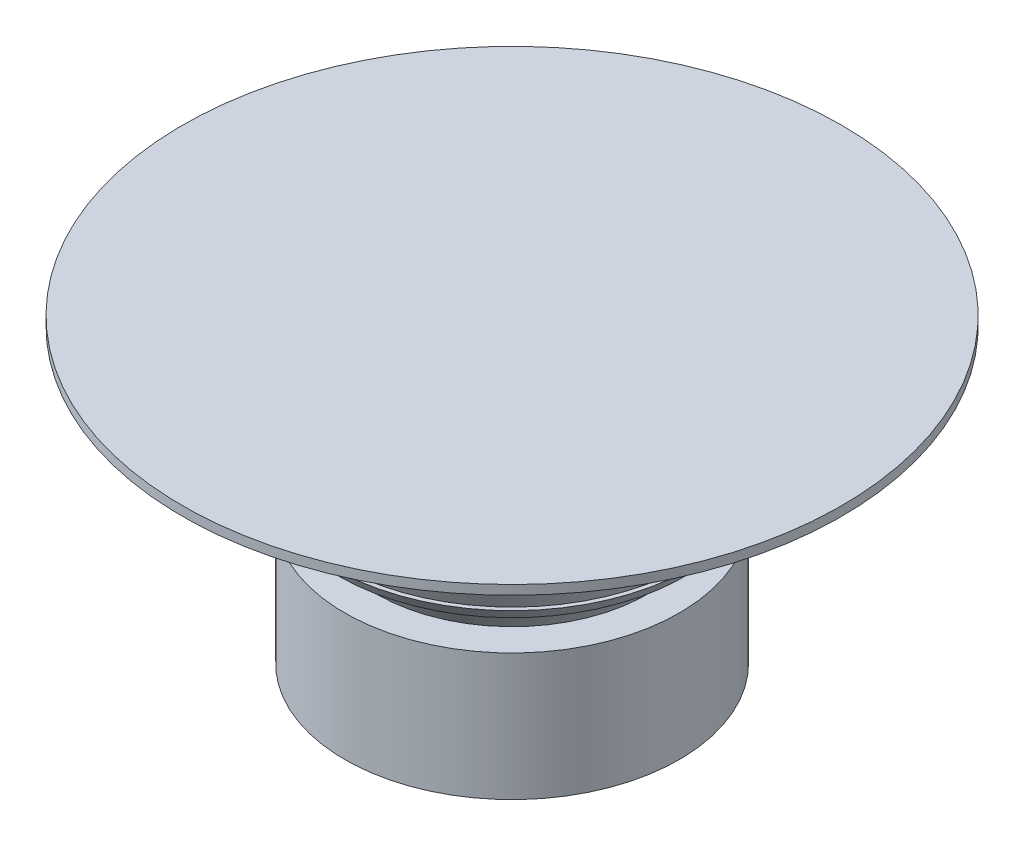
ISO-10303-21;
HEADER;
FILE_DESCRIPTION(('STEP AP214'),'2;1');
FILE_NAME('part.step','',(''),(''),'','','');
FILE_SCHEMA(('AUTOMOTIVE_DESIGN { 1 0 10303 214 1 1 1 1 }'));
ENDSEC;
DATA;
#1=APPLICATION_CONTEXT('core data for automotive mechanical design processes');
#2=APPLICATION_PROTOCOL_DEFINITION('international standard','automotive_design',2000,#1);
#3=PRODUCT_CONTEXT('',#1,'mechanical');
#4=PRODUCT('Part','Part','',(#3));
#5=PRODUCT_RELATED_PRODUCT_CATEGORY('part','',(#4));
#6=PRODUCT_DEFINITION_FORMATION('','',#4);
#7=PRODUCT_DEFINITION_CONTEXT('part definition',#1,'design');
#8=PRODUCT_DEFINITION('design','',#6,#7);
#9=PRODUCT_DEFINITION_SHAPE('','',#8);
#10=(LENGTH_UNIT() NAMED_UNIT(*) SI_UNIT(.MILLI.,.METRE.));
#11=(NAMED_UNIT(*) PLANE_ANGLE_UNIT() SI_UNIT($,.RADIAN.));
#12=(NAMED_UNIT(*) SI_UNIT($,.STERADIAN.) SOLID_ANGLE_UNIT());
#13=UNCERTAINTY_MEASURE_WITH_UNIT(LENGTH_MEASURE(1.E-05),#10,'distance_accuracy_value','');
#14=(GEOMETRIC_REPRESENTATION_CONTEXT(3) GLOBAL_UNCERTAINTY_ASSIGNED_CONTEXT((#13)) GLOBAL_UNIT_ASSIGNED_CONTEXT((#10,
#11,#12)) REPRESENTATION_CONTEXT('',''));
#15=CARTESIAN_POINT('',(0.,0.,0.));
#16=DIRECTION('',(0.,0.,1.));
#17=DIRECTION('',(1.,0.,0.));
#18=AXIS2_PLACEMENT_3D('',#15,#16,#17);
#19=CARTESIAN_POINT('',(0.,52.0358333333333,0.));
#20=DIRECTION('',(0.,1.,0.));
#21=DIRECTION('',(0.,0.,1.));
#22=AXIS2_PLACEMENT_3D('',#19,#20,#21);
#23=CONICAL_SURFACE('',#22,55.3356666666667,0.523278322131974);
#24=CARTESIAN_POINT('',(0.,66.2504999999999,0.));
#25=DIRECTION('',(0.,-1.,0.));
#26=DIRECTION('',(0.,0.,-1.));
#27=AXIS2_PLACEMENT_3D('',#24,#25,#26);
#28=CIRCLE('',#27,63.5364358974358);
#29=CARTESIAN_POINT('',(0.,66.2504999999999,-63.5364358974358));
#30=VERTEX_POINT('',#29);
#31=EDGE_CURVE('E43',#30,#30,#28,.F.);
#32=ORIENTED_EDGE('',*,*,#31,.F.);
#33=EDGE_LOOP('',(#32));
#34=FACE_BOUND('',#33,.T.);
#35=CARTESIAN_POINT('',(0.,52.0358333333333,0.));
#36=DIRECTION('',(0.,-1.,0.));
#37=DIRECTION('',(0.,0.,-1.));
#38=AXIS2_PLACEMENT_3D('',#35,#36,#37);
#39=CIRCLE('',#38,55.3356666666667);
#40=CARTESIAN_POINT('',(0.,52.0358333333333,-55.3356666666667));
#41=VERTEX_POINT('',#40);
#42=EDGE_CURVE('E10',#41,#41,#39,.T.);
#43=ORIENTED_EDGE('',*,*,#42,.F.);
#44=EDGE_LOOP('',(#43));
#45=FACE_BOUND('',#44,.T.);
#46=ADVANCED_FACE('F29',(#34,#45),#23,.T.);
#47=CARTESIAN_POINT('',(68.535,52.0358333333333,0.));
#48=DIRECTION('',(0.,1.,0.));
#49=DIRECTION('',(0.,0.,1.));
#50=AXIS2_PLACEMENT_3D('',#47,#48,#49);
#51=PLANE('',#50);
#52=ORIENTED_EDGE('',*,*,#42,.T.);
#53=EDGE_LOOP('',(#52));
#54=FACE_BOUND('',#53,.T.);
#55=CARTESIAN_POINT('',(0.,52.0358333333333,0.));
#56=DIRECTION('',(0.,-1.,0.));
#57=DIRECTION('',(0.,0.,-1.));
#58=AXIS2_PLACEMENT_3D('',#55,#56,#57);
#59=CIRCLE('',#58,68.535);
#60=CARTESIAN_POINT('',(0.,52.0358333333333,-68.535));
#61=VERTEX_POINT('',#60);
#62=EDGE_CURVE('E35',#61,#61,#59,.T.);
#63=ORIENTED_EDGE('',*,*,#62,.F.);
#64=EDGE_LOOP('',(#63));
#65=FACE_BOUND('',#64,.T.);
#66=ADVANCED_FACE('F88',(#54,#65),#51,.T.);
#67=CARTESIAN_POINT('',(0.,0.,0.));
#68=DIRECTION('',(0.,-1.,0.));
#69=DIRECTION('',(0.,0.,-1.));
#70=AXIS2_PLACEMENT_3D('',#67,#68,#69);
#71=CYLINDRICAL_SURFACE('',#70,68.535);
#72=ORIENTED_EDGE('',*,*,#62,.T.);
#73=EDGE_LOOP('',(#72));
#74=FACE_BOUND('',#73,.T.);
#75=CARTESIAN_POINT('',(0.,0.,0.));
#76=DIRECTION('',(0.,-1.,0.));
#77=DIRECTION('',(0.,0.,-1.));
#78=AXIS2_PLACEMENT_3D('',#75,#76,#77);
#79=CIRCLE('',#78,68.535);
#80=CARTESIAN_POINT('',(0.,0.,-68.535));
#81=VERTEX_POINT('',#80);
#82=EDGE_CURVE('E39',#81,#81,#79,.T.);
#83=ORIENTED_EDGE('',*,*,#82,.F.);
#84=EDGE_LOOP('',(#83));
#85=FACE_BOUND('',#84,.T.);
#86=ADVANCED_FACE('F93',(#74,#85),#71,.T.);
#87=CARTESIAN_POINT('',(24.8756666666666,0.,0.));
#88=DIRECTION('',(0.,-1.,0.));
#89=DIRECTION('',(0.,0.,-1.));
#90=AXIS2_PLACEMENT_3D('',#87,#88,#89);
#91=PLANE('',#90);
#92=ORIENTED_EDGE('',*,*,#82,.T.);
#93=EDGE_LOOP('',(#92));
#94=FACE_BOUND('',#93,.T.);
#95=ADVANCED_FACE('F127',(#94),#91,.T.);
#96=CARTESIAN_POINT('',(73.8655,70.8194999999999,0.));
#97=DIRECTION('',(0.,1.,0.));
#98=DIRECTION('',(0.,0.,1.));
#99=AXIS2_PLACEMENT_3D('',#96,#97,#98);
#100=PLANE('',#99);
#101=CARTESIAN_POINT('',(0.,70.8194999999999,0.));
#102=DIRECTION('',(0.,-1.,0.));
#103=DIRECTION('',(0.,0.,-1.));
#104=AXIS2_PLACEMENT_3D('',#101,#102,#103);
#105=CIRCLE('',#104,72.0886666666667);
#106=CARTESIAN_POINT('',(0.,70.8194999999999,-72.0886666666667));
#107=VERTEX_POINT('',#106);
#108=EDGE_CURVE('E48',#107,#107,#105,.T.);
#109=ORIENTED_EDGE('',*,*,#108,.T.);
#110=EDGE_LOOP('',(#109));
#111=FACE_BOUND('',#110,.T.);
#112=CARTESIAN_POINT('',(0.,70.8194999999999,0.));
#113=DIRECTION('',(0.,-1.,0.));
#114=DIRECTION('',(0.,0.,-1.));
#115=AXIS2_PLACEMENT_3D('',#112,#113,#114);
#116=CIRCLE('',#115,73.8655);
#117=CARTESIAN_POINT('',(0.,70.8194999999999,-73.8655));
#118=VERTEX_POINT('',#117);
#119=EDGE_CURVE('E57',#118,#118,#116,.T.);
#120=ORIENTED_EDGE('',*,*,#119,.F.);
#121=EDGE_LOOP('',(#120));
#122=FACE_BOUND('',#121,.T.);
#123=ADVANCED_FACE('F123',(#111,#122),#100,.T.);
#124=CARTESIAN_POINT('',(0.,70.8194999999999,0.));
#125=DIRECTION('',(0.,1.,0.));
#126=DIRECTION('',(0.,0.,1.));
#127=AXIS2_PLACEMENT_3D('',#124,#125,#126);
#128=CONICAL_SURFACE('',#127,72.0886666666667,0.355635884300756);
#129=CARTESIAN_POINT('',(0.,94.6206018356625,0.));
#130=DIRECTION('',(0.,-1.,0.));
#131=DIRECTION('',(0.,0.,-1.));
#132=AXIS2_PLACEMENT_3D('',#129,#130,#131);
#133=CIRCLE('',#132,80.9290759199127);
#134=CARTESIAN_POINT('',(0.,94.6206018356625,-80.9290759199127));
#135=VERTEX_POINT('',#134);
#136=EDGE_CURVE('E51',#135,#135,#133,.T.);
#137=ORIENTED_EDGE('',*,*,#136,.T.);
#138=EDGE_LOOP('',(#137));
#139=FACE_BOUND('',#138,.T.);
#140=ORIENTED_EDGE('',*,*,#108,.F.);
#141=EDGE_LOOP('',(#140));
#142=FACE_BOUND('',#141,.T.);
#143=ADVANCED_FACE('F119',(#139,#142),#128,.T.);
#144=CARTESIAN_POINT('',(0.,42.2074752829374,0.));
#145=DIRECTION('',(0.,-1.,0.));
#146=DIRECTION('',(0.,0.,-1.));
#147=AXIS2_PLACEMENT_3D('',#144,#145,#146);
#148=TOROIDAL_SURFACE('',#147,208.635067954986,138.043312901039);
#149=CARTESIAN_POINT('',(0.,109.909833333333,0.));
#150=DIRECTION('',(0.,1.,0.));
#151=DIRECTION('',(0.,0.,1.));
#152=AXIS2_PLACEMENT_3D('',#149,#150,#151);
#153=CIRCLE('',#152,88.3339999999999);
#154=CARTESIAN_POINT('',(0.,109.909833333333,88.3339999999999));
#155=VERTEX_POINT('',#154);
#156=EDGE_CURVE('E60',#155,#155,#153,.T.);
#157=ORIENTED_EDGE('',*,*,#156,.F.);
#158=EDGE_LOOP('',(#157));
#159=FACE_BOUND('',#158,.T.);
#160=ORIENTED_EDGE('',*,*,#136,.F.);
#161=EDGE_LOOP('',(#160));
#162=FACE_BOUND('',#161,.T.);
#163=ADVANCED_FACE('F101',(#159,#162),#148,.F.);
#164=CARTESIAN_POINT('',(0.,66.2504999999999,0.));
#165=DIRECTION('',(0.,-1.,0.));
#166=DIRECTION('',(0.,0.,-1.));
#167=AXIS2_PLACEMENT_3D('',#164,#165,#166);
#168=PLANE('',#167);
#169=ORIENTED_EDGE('',*,*,#31,.T.);
#170=EDGE_LOOP('',(#169));
#171=FACE_BOUND('',#170,.T.);
#172=CARTESIAN_POINT('',(0.,66.2504999999999,0.));
#173=DIRECTION('',(0.,-1.,0.));
#174=DIRECTION('',(0.,0.,-1.));
#175=AXIS2_PLACEMENT_3D('',#172,#173,#174);
#176=CIRCLE('',#175,70.9282857142856);
#177=CARTESIAN_POINT('',(0.,66.2504999999999,-70.9282857142856));
#178=VERTEX_POINT('',#177);
#179=EDGE_CURVE('E54',#178,#178,#176,.T.);
#180=ORIENTED_EDGE('',*,*,#179,.T.);
#181=EDGE_LOOP('',(#180));
#182=FACE_BOUND('',#181,.T.);
#183=ADVANCED_FACE('F97',(#171,#182),#168,.T.);
#184=CARTESIAN_POINT('',(0.,66.2504999999999,0.));
#185=DIRECTION('',(0.,1.,0.));
#186=DIRECTION('',(0.,0.,1.));
#187=AXIS2_PLACEMENT_3D('',#184,#185,#186);
#188=CONICAL_SURFACE('',#187,70.9282857142856,0.571337479833634);
#189=ORIENTED_EDGE('',*,*,#119,.T.);
#190=EDGE_LOOP('',(#189));
#191=FACE_BOUND('',#190,.T.);
#192=ORIENTED_EDGE('',*,*,#179,.F.);
#193=EDGE_LOOP('',(#192));
#194=FACE_BOUND('',#193,.T.);
#195=ADVANCED_FACE('F100',(#191,#194),#188,.T.);
#196=CARTESIAN_POINT('',(0.,109.909833333333,0.));
#197=DIRECTION('',(0.,-1.,0.));
#198=DIRECTION('',(0.,0.,-1.));
#199=AXIS2_PLACEMENT_3D('',#196,#197,#198);
#200=PLANE('',#199);
#201=ORIENTED_EDGE('',*,*,#156,.T.);
#202=EDGE_LOOP('',(#201));
#203=FACE_BOUND('',#202,.T.);
#204=CARTESIAN_POINT('',(0.,109.909833333333,0.));
#205=DIRECTION('',(0.,-1.,0.));
#206=DIRECTION('',(0.,0.,-1.));
#207=AXIS2_PLACEMENT_3D('',#204,#205,#206);
#208=CIRCLE('',#207,113.4635);
#209=CARTESIAN_POINT('',(0.,109.909833333333,-113.4635));
#210=VERTEX_POINT('',#209);
#211=EDGE_CURVE('E63',#210,#210,#208,.T.);
#212=ORIENTED_EDGE('',*,*,#211,.T.);
#213=EDGE_LOOP('',(#212));
#214=FACE_BOUND('',#213,.T.);
#215=ADVANCED_FACE('F106',(#203,#214),#200,.T.);
#216=CARTESIAN_POINT('',(0.,0.,0.));
#217=DIRECTION('',(0.,-1.,0.));
#218=DIRECTION('',(0.,0.,-1.));
#219=AXIS2_PLACEMENT_3D('',#216,#217,#218);
#220=CYLINDRICAL_SURFACE('',#219,113.4635);
#221=CARTESIAN_POINT('',(0.,119.5555,0.));
#222=DIRECTION('',(0.,-1.,0.));
#223=DIRECTION('',(0.,0.,-1.));
#224=AXIS2_PLACEMENT_3D('',#221,#222,#223);
#225=CIRCLE('',#224,113.4635);
#226=CARTESIAN_POINT('',(0.,119.5555,-113.4635));
#227=VERTEX_POINT('',#226);
#228=EDGE_CURVE('E66',#227,#227,#225,.T.);
#229=ORIENTED_EDGE('',*,*,#228,.T.);
#230=EDGE_LOOP('',(#229));
#231=FACE_BOUND('',#230,.T.);
#232=ORIENTED_EDGE('',*,*,#211,.F.);
#233=EDGE_LOOP('',(#232));
#234=FACE_BOUND('',#233,.T.);
#235=ADVANCED_FACE('F112',(#231,#234),#220,.T.);
#236=CARTESIAN_POINT('',(135.039333333333,119.5555,0.));
#237=DIRECTION('',(0.,-1.,0.));
#238=DIRECTION('',(0.,0.,-1.));
#239=AXIS2_PLACEMENT_3D('',#236,#237,#238);
#240=PLANE('',#239);
#241=CARTESIAN_POINT('',(0.,119.5555,0.));
#242=DIRECTION('',(0.,-1.,0.));
#243=DIRECTION('',(0.,0.,-1.));
#244=AXIS2_PLACEMENT_3D('',#241,#242,#243);
#245=CIRCLE('',#244,135.039333333333);
#246=CARTESIAN_POINT('',(0.,119.5555,-135.039333333333));
#247=VERTEX_POINT('',#246);
#248=EDGE_CURVE('E69',#247,#247,#245,.T.);
#249=ORIENTED_EDGE('',*,*,#248,.T.);
#250=EDGE_LOOP('',(#249));
#251=FACE_BOUND('',#250,.T.);
#252=ORIENTED_EDGE('',*,*,#228,.F.);
#253=EDGE_LOOP('',(#252));
#254=FACE_BOUND('',#253,.T.);
#255=ADVANCED_FACE('F85',(#251,#254),#240,.T.);
#256=CARTESIAN_POINT('',(0.,0.,0.));
#257=DIRECTION('',(0.,-1.,0.));
#258=DIRECTION('',(0.,0.,-1.));
#259=AXIS2_PLACEMENT_3D('',#256,#257,#258);
#260=CYLINDRICAL_SURFACE('',#259,135.039333333333);
#261=CARTESIAN_POINT('',(0.,123.363,0.));
#262=DIRECTION('',(0.,-1.,0.));
#263=DIRECTION('',(0.,0.,-1.));
#264=AXIS2_PLACEMENT_3D('',#261,#262,#263);
#265=CIRCLE('',#264,135.039333333333);
#266=CARTESIAN_POINT('',(0.,123.363,-135.039333333333));
#267=VERTEX_POINT('',#266);
#268=EDGE_CURVE('E72',#267,#267,#265,.T.);
#269=ORIENTED_EDGE('',*,*,#268,.T.);
#270=EDGE_LOOP('',(#269));
#271=FACE_BOUND('',#270,.T.);
#272=ORIENTED_EDGE('',*,*,#248,.F.);
#273=EDGE_LOOP('',(#272));
#274=FACE_BOUND('',#273,.T.);
#275=ADVANCED_FACE('F76',(#271,#274),#260,.T.);
#276=CARTESIAN_POINT('',(0.,123.363,0.));
#277=DIRECTION('',(0.,1.,0.));
#278=DIRECTION('',(0.,0.,1.));
#279=AXIS2_PLACEMENT_3D('',#276,#277,#278);
#280=PLANE('',#279);
#281=ORIENTED_EDGE('',*,*,#268,.F.);
#282=EDGE_LOOP('',(#281));
#283=FACE_BOUND('',#282,.T.);
#284=ADVANCED_FACE('F79',(#283),#280,.T.);
#285=CLOSED_SHELL('',(#46,#66,#86,#95,#123,#143,#163,#183,#195,#215,#235,#255,#275,#284));
#286=MANIFOLD_SOLID_BREP('B2',#285);
#287=ADVANCED_BREP_SHAPE_REPRESENTATION('',(#18,#286),#14);
#288=SHAPE_DEFINITION_REPRESENTATION(#9,#287);
ENDSEC;
END-ISO-10303-21;
